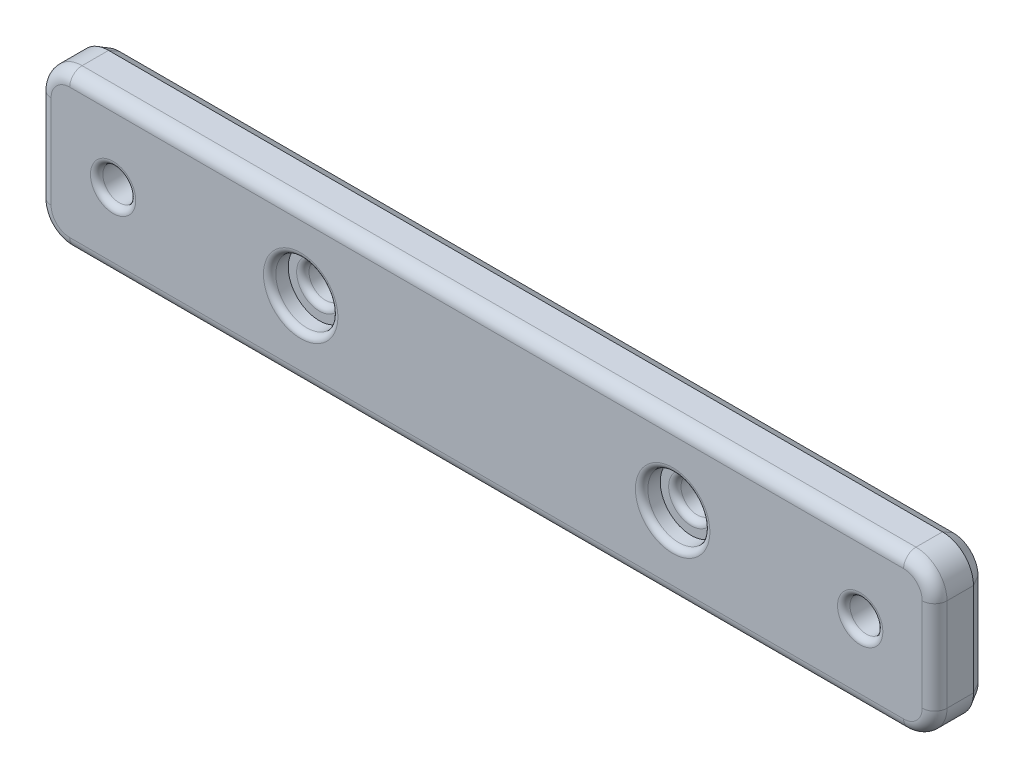
ISO-10303-21;
HEADER;
FILE_DESCRIPTION(('STEP AP214'),'2;1');
FILE_NAME('part.step','',(''),(''),'','','');
FILE_SCHEMA(('AUTOMOTIVE_DESIGN { 1 0 10303 214 1 1 1 1 }'));
ENDSEC;
DATA;
#1=APPLICATION_CONTEXT('core data for automotive mechanical design processes');
#2=APPLICATION_PROTOCOL_DEFINITION('international standard','automotive_design',2000,#1);
#3=PRODUCT_CONTEXT('',#1,'mechanical');
#4=PRODUCT('Part','Part','',(#3));
#5=PRODUCT_RELATED_PRODUCT_CATEGORY('part','',(#4));
#6=PRODUCT_DEFINITION_FORMATION('','',#4);
#7=PRODUCT_DEFINITION_CONTEXT('part definition',#1,'design');
#8=PRODUCT_DEFINITION('design','',#6,#7);
#9=PRODUCT_DEFINITION_SHAPE('','',#8);
#10=(LENGTH_UNIT() NAMED_UNIT(*) SI_UNIT(.MILLI.,.METRE.));
#11=(NAMED_UNIT(*) PLANE_ANGLE_UNIT() SI_UNIT($,.RADIAN.));
#12=(NAMED_UNIT(*) SI_UNIT($,.STERADIAN.) SOLID_ANGLE_UNIT());
#13=UNCERTAINTY_MEASURE_WITH_UNIT(LENGTH_MEASURE(1.E-05),#10,'distance_accuracy_value','');
#14=(GEOMETRIC_REPRESENTATION_CONTEXT(3) GLOBAL_UNCERTAINTY_ASSIGNED_CONTEXT((#13)) GLOBAL_UNIT_ASSIGNED_CONTEXT((#10,
#11,#12)) REPRESENTATION_CONTEXT('',''));
#15=CARTESIAN_POINT('',(0.,0.,0.));
#16=DIRECTION('',(0.,0.,1.));
#17=DIRECTION('',(1.,0.,0.));
#18=AXIS2_PLACEMENT_3D('',#15,#16,#17);
#19=CARTESIAN_POINT('',(-30.,0.,0.));
#20=DIRECTION('',(0.,0.,1.));
#21=DIRECTION('',(1.,0.,0.));
#22=AXIS2_PLACEMENT_3D('',#19,#20,#21);
#23=CYLINDRICAL_SURFACE('',#22,2.65);
#24=CARTESIAN_POINT('',(-30.,0.,1.00000000000005));
#25=DIRECTION('',(0.,0.,-1.));
#26=DIRECTION('',(-1.,0.,0.));
#27=AXIS2_PLACEMENT_3D('',#24,#25,#26);
#28=CIRCLE('',#27,2.65);
#29=CARTESIAN_POINT('',(-32.65,0.,1.00000000000005));
#30=VERTEX_POINT('',#29);
#31=EDGE_CURVE('E49',#30,#30,#28,.T.);
#32=ORIENTED_EDGE('',*,*,#31,.T.);
#33=EDGE_LOOP('',(#32));
#34=FACE_BOUND('',#33,.T.);
#35=CARTESIAN_POINT('',(-30.,0.,4.));
#36=DIRECTION('',(0.,0.,1.));
#37=DIRECTION('',(1.,0.,0.));
#38=AXIS2_PLACEMENT_3D('',#35,#36,#37);
#39=CIRCLE('',#38,2.65);
#40=CARTESIAN_POINT('',(-27.35,0.,4.));
#41=VERTEX_POINT('',#40);
#42=EDGE_CURVE('E234',#41,#41,#39,.T.);
#43=ORIENTED_EDGE('',*,*,#42,.T.);
#44=EDGE_LOOP('',(#43));
#45=FACE_BOUND('',#44,.T.);
#46=ADVANCED_FACE('F40',(#34,#45),#23,.F.);
#47=CARTESIAN_POINT('',(30.,0.,0.));
#48=DIRECTION('',(0.,0.,1.));
#49=DIRECTION('',(1.,0.,0.));
#50=AXIS2_PLACEMENT_3D('',#47,#48,#49);
#51=CYLINDRICAL_SURFACE('',#50,2.65);
#52=CARTESIAN_POINT('',(30.,0.,1.));
#53=DIRECTION('',(0.,0.,-1.));
#54=DIRECTION('',(-1.,0.,0.));
#55=AXIS2_PLACEMENT_3D('',#52,#53,#54);
#56=CIRCLE('',#55,2.65);
#57=CARTESIAN_POINT('',(27.35,0.,1.));
#58=VERTEX_POINT('',#57);
#59=EDGE_CURVE('E329',#58,#58,#56,.T.);
#60=ORIENTED_EDGE('',*,*,#59,.T.);
#61=EDGE_LOOP('',(#60));
#62=FACE_BOUND('',#61,.T.);
#63=CARTESIAN_POINT('',(30.,0.,4.));
#64=DIRECTION('',(0.,0.,1.));
#65=DIRECTION('',(1.,0.,0.));
#66=AXIS2_PLACEMENT_3D('',#63,#64,#65);
#67=CIRCLE('',#66,2.65);
#68=CARTESIAN_POINT('',(32.65,0.,4.));
#69=VERTEX_POINT('',#68);
#70=EDGE_CURVE('E228',#69,#69,#67,.T.);
#71=ORIENTED_EDGE('',*,*,#70,.T.);
#72=EDGE_LOOP('',(#71));
#73=FACE_BOUND('',#72,.T.);
#74=ADVANCED_FACE('F464',(#62,#73),#51,.F.);
#75=CARTESIAN_POINT('',(72.25,-12.5,8.));
#76=DIRECTION('',(-1.,0.,0.));
#77=DIRECTION('',(0.,0.,1.));
#78=AXIS2_PLACEMENT_3D('',#75,#76,#77);
#79=PLANE('',#78);
#80=DIRECTION('',(0.,0.,-1.));
#81=VECTOR('',#80,1.);
#82=CARTESIAN_POINT('',(72.25,-7.5,8.));
#83=LINE('',#82,#81);
#84=CARTESIAN_POINT('',(72.25,-7.5,6.));
#85=VERTEX_POINT('',#84);
#86=CARTESIAN_POINT('',(72.25,-7.5,1.73205080756889));
#87=VERTEX_POINT('',#86);
#88=EDGE_CURVE('E178',#85,#87,#83,.T.);
#89=ORIENTED_EDGE('',*,*,#88,.T.);
#90=DIRECTION('',(0.,1.,0.));
#91=VECTOR('',#90,1.);
#92=CARTESIAN_POINT('',(72.25,7.5,1.73205080756889));
#93=LINE('',#92,#91);
#94=CARTESIAN_POINT('',(72.25,7.5,1.73205080756889));
#95=VERTEX_POINT('',#94);
#96=EDGE_CURVE('E287',#87,#95,#93,.T.);
#97=ORIENTED_EDGE('',*,*,#96,.T.);
#98=DIRECTION('',(0.,0.,-1.));
#99=VECTOR('',#98,1.);
#100=CARTESIAN_POINT('',(72.25,7.5,8.));
#101=LINE('',#100,#99);
#102=CARTESIAN_POINT('',(72.25,7.5,6.));
#103=VERTEX_POINT('',#102);
#104=EDGE_CURVE('E375',#95,#103,#101,.F.);
#105=ORIENTED_EDGE('',*,*,#104,.T.);
#106=DIRECTION('',(0.,1.,0.));
#107=VECTOR('',#106,1.);
#108=CARTESIAN_POINT('',(72.25,-12.5,6.));
#109=LINE('',#108,#107);
#110=EDGE_CURVE('E185',#103,#85,#109,.F.);
#111=ORIENTED_EDGE('',*,*,#110,.T.);
#112=EDGE_LOOP('',(#89,#97,#105,#111));
#113=FACE_BOUND('',#112,.T.);
#114=ADVANCED_FACE('F469',(#113),#79,.F.);
#115=CARTESIAN_POINT('',(-72.25,12.5,8.));
#116=DIRECTION('',(0.,-1.,0.));
#117=DIRECTION('',(0.,0.,-1.));
#118=AXIS2_PLACEMENT_3D('',#115,#116,#117);
#119=PLANE('',#118);
#120=DIRECTION('',(0.,0.,-1.));
#121=VECTOR('',#120,1.);
#122=CARTESIAN_POINT('',(67.25,12.5,8.));
#123=LINE('',#122,#121);
#124=CARTESIAN_POINT('',(67.25,12.5,6.));
#125=VERTEX_POINT('',#124);
#126=CARTESIAN_POINT('',(67.25,12.5,1.73205080756889));
#127=VERTEX_POINT('',#126);
#128=EDGE_CURVE('E372',#125,#127,#123,.T.);
#129=ORIENTED_EDGE('',*,*,#128,.T.);
#130=DIRECTION('',(-1.,0.,0.));
#131=VECTOR('',#130,1.);
#132=CARTESIAN_POINT('',(-67.25,12.5,1.73205080756889));
#133=LINE('',#132,#131);
#134=CARTESIAN_POINT('',(-67.25,12.5,1.73205080756889));
#135=VERTEX_POINT('',#134);
#136=EDGE_CURVE('E261',#127,#135,#133,.T.);
#137=ORIENTED_EDGE('',*,*,#136,.T.);
#138=DIRECTION('',(0.,0.,-1.));
#139=VECTOR('',#138,1.);
#140=CARTESIAN_POINT('',(-67.25,12.5,8.));
#141=LINE('',#140,#139);
#142=CARTESIAN_POINT('',(-67.25,12.5,6.));
#143=VERTEX_POINT('',#142);
#144=EDGE_CURVE('E370',#135,#143,#141,.F.);
#145=ORIENTED_EDGE('',*,*,#144,.T.);
#146=DIRECTION('',(-1.,0.,0.));
#147=VECTOR('',#146,1.);
#148=CARTESIAN_POINT('',(-72.25,12.5,6.));
#149=LINE('',#148,#147);
#150=EDGE_CURVE('E205',#143,#125,#149,.F.);
#151=ORIENTED_EDGE('',*,*,#150,.T.);
#152=EDGE_LOOP('',(#129,#137,#145,#151));
#153=FACE_BOUND('',#152,.T.);
#154=ADVANCED_FACE('F369',(#153),#119,.F.);
#155=CARTESIAN_POINT('',(-72.25,-12.5,8.));
#156=DIRECTION('',(1.,0.,0.));
#157=DIRECTION('',(0.,0.,-1.));
#158=AXIS2_PLACEMENT_3D('',#155,#156,#157);
#159=PLANE('',#158);
#160=DIRECTION('',(0.,0.,-1.));
#161=VECTOR('',#160,1.);
#162=CARTESIAN_POINT('',(-72.25,7.5,8.));
#163=LINE('',#162,#161);
#164=CARTESIAN_POINT('',(-72.25,7.5,6.));
#165=VERTEX_POINT('',#164);
#166=CARTESIAN_POINT('',(-72.25,7.5,1.73205080756889));
#167=VERTEX_POINT('',#166);
#168=EDGE_CURVE('E432',#165,#167,#163,.T.);
#169=ORIENTED_EDGE('',*,*,#168,.T.);
#170=DIRECTION('',(0.,-1.,0.));
#171=VECTOR('',#170,1.);
#172=CARTESIAN_POINT('',(-72.25,-7.5,1.73205080756889));
#173=LINE('',#172,#171);
#174=CARTESIAN_POINT('',(-72.25,-7.5,1.73205080756889));
#175=VERTEX_POINT('',#174);
#176=EDGE_CURVE('E285',#167,#175,#173,.T.);
#177=ORIENTED_EDGE('',*,*,#176,.T.);
#178=DIRECTION('',(0.,0.,-1.));
#179=VECTOR('',#178,1.);
#180=CARTESIAN_POINT('',(-72.25,-7.5,8.));
#181=LINE('',#180,#179);
#182=CARTESIAN_POINT('',(-72.25,-7.5,6.));
#183=VERTEX_POINT('',#182);
#184=EDGE_CURVE('E378',#175,#183,#181,.F.);
#185=ORIENTED_EDGE('',*,*,#184,.T.);
#186=DIRECTION('',(0.,-1.,0.));
#187=VECTOR('',#186,1.);
#188=CARTESIAN_POINT('',(-72.25,-12.5,6.));
#189=LINE('',#188,#187);
#190=EDGE_CURVE('E200',#183,#165,#189,.F.);
#191=ORIENTED_EDGE('',*,*,#190,.T.);
#192=EDGE_LOOP('',(#169,#177,#185,#191));
#193=FACE_BOUND('',#192,.T.);
#194=ADVANCED_FACE('F431',(#193),#159,.F.);
#195=CARTESIAN_POINT('',(-72.25,-12.5,8.));
#196=DIRECTION('',(0.,1.,0.));
#197=DIRECTION('',(0.,0.,1.));
#198=AXIS2_PLACEMENT_3D('',#195,#196,#197);
#199=PLANE('',#198);
#200=DIRECTION('',(0.,0.,-1.));
#201=VECTOR('',#200,1.);
#202=CARTESIAN_POINT('',(-67.25,-12.5,8.));
#203=LINE('',#202,#201);
#204=CARTESIAN_POINT('',(-67.25,-12.5,6.));
#205=VERTEX_POINT('',#204);
#206=CARTESIAN_POINT('',(-67.25,-12.5,1.73205080756889));
#207=VERTEX_POINT('',#206);
#208=EDGE_CURVE('E436',#205,#207,#203,.T.);
#209=ORIENTED_EDGE('',*,*,#208,.T.);
#210=DIRECTION('',(1.,0.,0.));
#211=VECTOR('',#210,1.);
#212=CARTESIAN_POINT('',(67.25,-12.5,1.73205080756889));
#213=LINE('',#212,#211);
#214=CARTESIAN_POINT('',(67.25,-12.5,1.73205080756889));
#215=VERTEX_POINT('',#214);
#216=EDGE_CURVE('E56',#207,#215,#213,.T.);
#217=ORIENTED_EDGE('',*,*,#216,.T.);
#218=DIRECTION('',(0.,0.,-1.));
#219=VECTOR('',#218,1.);
#220=CARTESIAN_POINT('',(67.25,-12.5,8.));
#221=LINE('',#220,#219);
#222=CARTESIAN_POINT('',(67.25,-12.5,6.));
#223=VERTEX_POINT('',#222);
#224=EDGE_CURVE('E440',#215,#223,#221,.F.);
#225=ORIENTED_EDGE('',*,*,#224,.T.);
#226=DIRECTION('',(1.,0.,0.));
#227=VECTOR('',#226,1.);
#228=CARTESIAN_POINT('',(-72.25,-12.5,6.));
#229=LINE('',#228,#227);
#230=EDGE_CURVE('E195',#223,#205,#229,.F.);
#231=ORIENTED_EDGE('',*,*,#230,.T.);
#232=EDGE_LOOP('',(#209,#217,#225,#231));
#233=FACE_BOUND('',#232,.T.);
#234=ADVANCED_FACE('F475',(#233),#199,.F.);
#235=CARTESIAN_POINT('',(0.,0.,8.));
#236=DIRECTION('',(0.,0.,-1.));
#237=DIRECTION('',(-1.,0.,0.));
#238=AXIS2_PLACEMENT_3D('',#235,#236,#237);
#239=PLANE('',#238);
#240=CARTESIAN_POINT('',(60.25,0.,8.));
#241=DIRECTION('',(0.,0.,-1.));
#242=DIRECTION('',(-1.,0.,0.));
#243=AXIS2_PLACEMENT_3D('',#240,#241,#242);
#244=CIRCLE('',#243,3.65);
#245=CARTESIAN_POINT('',(56.6,0.,8.));
#246=VERTEX_POINT('',#245);
#247=EDGE_CURVE('E249',#246,#246,#244,.T.);
#248=ORIENTED_EDGE('',*,*,#247,.T.);
#249=EDGE_LOOP('',(#248));
#250=FACE_BOUND('',#249,.T.);
#251=CARTESIAN_POINT('',(-60.25,0.,8.));
#252=DIRECTION('',(0.,0.,-1.));
#253=DIRECTION('',(-1.,0.,0.));
#254=AXIS2_PLACEMENT_3D('',#251,#252,#253);
#255=CIRCLE('',#254,3.65);
#256=CARTESIAN_POINT('',(-63.9,0.,8.));
#257=VERTEX_POINT('',#256);
#258=EDGE_CURVE('E246',#257,#257,#255,.T.);
#259=ORIENTED_EDGE('',*,*,#258,.T.);
#260=EDGE_LOOP('',(#259));
#261=FACE_BOUND('',#260,.T.);
#262=CARTESIAN_POINT('',(30.,0.,8.));
#263=DIRECTION('',(0.,0.,-1.));
#264=DIRECTION('',(-1.,0.,0.));
#265=AXIS2_PLACEMENT_3D('',#262,#263,#264);
#266=CIRCLE('',#265,6.);
#267=CARTESIAN_POINT('',(24.,0.,8.));
#268=VERTEX_POINT('',#267);
#269=EDGE_CURVE('E243',#268,#268,#266,.T.);
#270=ORIENTED_EDGE('',*,*,#269,.T.);
#271=EDGE_LOOP('',(#270));
#272=FACE_BOUND('',#271,.T.);
#273=CARTESIAN_POINT('',(-30.,0.,8.));
#274=DIRECTION('',(0.,0.,-1.));
#275=DIRECTION('',(-1.,0.,0.));
#276=AXIS2_PLACEMENT_3D('',#273,#274,#275);
#277=CIRCLE('',#276,6.);
#278=CARTESIAN_POINT('',(-36.,0.,8.));
#279=VERTEX_POINT('',#278);
#280=EDGE_CURVE('E240',#279,#279,#277,.T.);
#281=ORIENTED_EDGE('',*,*,#280,.T.);
#282=EDGE_LOOP('',(#281));
#283=FACE_BOUND('',#282,.T.);
#284=DIRECTION('',(0.,1.,0.));
#285=VECTOR('',#284,1.);
#286=CARTESIAN_POINT('',(70.25,0.,8.));
#287=LINE('',#286,#285);
#288=CARTESIAN_POINT('',(70.25,-7.5,8.));
#289=VERTEX_POINT('',#288);
#290=CARTESIAN_POINT('',(70.25,7.5,8.));
#291=VERTEX_POINT('',#290);
#292=EDGE_CURVE('E182',#289,#291,#287,.T.);
#293=ORIENTED_EDGE('',*,*,#292,.T.);
#294=CARTESIAN_POINT('',(67.25,7.5,8.));
#295=DIRECTION('',(0.,0.,-1.));
#296=DIRECTION('',(-1.,0.,0.));
#297=AXIS2_PLACEMENT_3D('',#294,#295,#296);
#298=CIRCLE('',#297,3.);
#299=CARTESIAN_POINT('',(67.25,10.5,8.));
#300=VERTEX_POINT('',#299);
#301=EDGE_CURVE('E162',#291,#300,#298,.F.);
#302=ORIENTED_EDGE('',*,*,#301,.T.);
#303=DIRECTION('',(-1.,0.,0.));
#304=VECTOR('',#303,1.);
#305=CARTESIAN_POINT('',(0.,10.5,8.));
#306=LINE('',#305,#304);
#307=CARTESIAN_POINT('',(-67.25,10.5,8.));
#308=VERTEX_POINT('',#307);
#309=EDGE_CURVE('E171',#300,#308,#306,.T.);
#310=ORIENTED_EDGE('',*,*,#309,.T.);
#311=CARTESIAN_POINT('',(-67.25,7.5,8.));
#312=DIRECTION('',(0.,0.,-1.));
#313=DIRECTION('',(-1.,0.,0.));
#314=AXIS2_PLACEMENT_3D('',#311,#312,#313);
#315=CIRCLE('',#314,3.);
#316=CARTESIAN_POINT('',(-70.25,7.5,8.));
#317=VERTEX_POINT('',#316);
#318=EDGE_CURVE('E177',#308,#317,#315,.F.);
#319=ORIENTED_EDGE('',*,*,#318,.T.);
#320=DIRECTION('',(0.,-1.,0.));
#321=VECTOR('',#320,1.);
#322=CARTESIAN_POINT('',(-70.25,0.,8.));
#323=LINE('',#322,#321);
#324=CARTESIAN_POINT('',(-70.25,-7.5,8.));
#325=VERTEX_POINT('',#324);
#326=EDGE_CURVE('E385',#317,#325,#323,.T.);
#327=ORIENTED_EDGE('',*,*,#326,.T.);
#328=CARTESIAN_POINT('',(-67.25,-7.5,8.));
#329=DIRECTION('',(0.,0.,-1.));
#330=DIRECTION('',(-1.,0.,0.));
#331=AXIS2_PLACEMENT_3D('',#328,#329,#330);
#332=CIRCLE('',#331,3.);
#333=CARTESIAN_POINT('',(-67.25,-10.5,8.));
#334=VERTEX_POINT('',#333);
#335=EDGE_CURVE('E387',#325,#334,#332,.F.);
#336=ORIENTED_EDGE('',*,*,#335,.T.);
#337=DIRECTION('',(1.,0.,0.));
#338=VECTOR('',#337,1.);
#339=CARTESIAN_POINT('',(0.,-10.5,8.));
#340=LINE('',#339,#338);
#341=CARTESIAN_POINT('',(67.25,-10.5,8.));
#342=VERTEX_POINT('',#341);
#343=EDGE_CURVE('E389',#334,#342,#340,.T.);
#344=ORIENTED_EDGE('',*,*,#343,.T.);
#345=CARTESIAN_POINT('',(67.25,-7.5,8.));
#346=DIRECTION('',(0.,0.,-1.));
#347=DIRECTION('',(-1.,0.,0.));
#348=AXIS2_PLACEMENT_3D('',#345,#346,#347);
#349=CIRCLE('',#348,3.);
#350=EDGE_CURVE('E187',#342,#289,#349,.F.);
#351=ORIENTED_EDGE('',*,*,#350,.T.);
#352=EDGE_LOOP('',(#293,#302,#310,#319,#327,#336,#344,#351));
#353=FACE_BOUND('',#352,.T.);
#354=ADVANCED_FACE('F180',(#250,#261,#272,#283,#353),#239,.F.);
#355=CARTESIAN_POINT('',(0.,0.,0.));
#356=DIRECTION('',(0.,0.,-1.));
#357=DIRECTION('',(-1.,0.,0.));
#358=AXIS2_PLACEMENT_3D('',#355,#356,#357);
#359=PLANE('',#358);
#360=CARTESIAN_POINT('',(60.25,0.,0.));
#361=DIRECTION('',(0.,0.,-1.));
#362=DIRECTION('',(-1.,0.,0.));
#363=AXIS2_PLACEMENT_3D('',#360,#361,#362);
#364=CIRCLE('',#363,3.22735026918966);
#365=CARTESIAN_POINT('',(57.0226497308104,0.,0.));
#366=VERTEX_POINT('',#365);
#367=EDGE_CURVE('E323',#366,#366,#364,.F.);
#368=ORIENTED_EDGE('',*,*,#367,.T.);
#369=EDGE_LOOP('',(#368));
#370=FACE_BOUND('',#369,.T.);
#371=CARTESIAN_POINT('',(30.,0.,0.));
#372=DIRECTION('',(0.,0.,-1.));
#373=DIRECTION('',(-1.,0.,0.));
#374=AXIS2_PLACEMENT_3D('',#371,#372,#373);
#375=CIRCLE('',#374,3.22735026918963);
#376=CARTESIAN_POINT('',(26.7726497308104,0.,0.));
#377=VERTEX_POINT('',#376);
#378=EDGE_CURVE('E320',#377,#377,#375,.F.);
#379=ORIENTED_EDGE('',*,*,#378,.T.);
#380=EDGE_LOOP('',(#379));
#381=FACE_BOUND('',#380,.T.);
#382=CARTESIAN_POINT('',(-30.,0.,0.));
#383=DIRECTION('',(0.,0.,-1.));
#384=DIRECTION('',(-1.,0.,0.));
#385=AXIS2_PLACEMENT_3D('',#382,#383,#384);
#386=CIRCLE('',#385,3.22735026918966);
#387=CARTESIAN_POINT('',(-33.2273502691896,0.,0.));
#388=VERTEX_POINT('',#387);
#389=EDGE_CURVE('E317',#388,#388,#386,.F.);
#390=ORIENTED_EDGE('',*,*,#389,.T.);
#391=EDGE_LOOP('',(#390));
#392=FACE_BOUND('',#391,.T.);
#393=CARTESIAN_POINT('',(-60.25,0.,0.));
#394=DIRECTION('',(0.,0.,-1.));
#395=DIRECTION('',(-1.,0.,0.));
#396=AXIS2_PLACEMENT_3D('',#393,#394,#395);
#397=CIRCLE('',#396,3.22735026918961);
#398=CARTESIAN_POINT('',(-63.4773502691896,0.,0.));
#399=VERTEX_POINT('',#398);
#400=EDGE_CURVE('E293',#399,#399,#397,.F.);
#401=ORIENTED_EDGE('',*,*,#400,.T.);
#402=EDGE_LOOP('',(#401));
#403=FACE_BOUND('',#402,.T.);
#404=CARTESIAN_POINT('',(-67.25,7.5,0.));
#405=DIRECTION('',(0.,0.,-1.));
#406=DIRECTION('',(-1.,0.,0.));
#407=AXIS2_PLACEMENT_3D('',#404,#405,#406);
#408=CIRCLE('',#407,3.99999999999999);
#409=CARTESIAN_POINT('',(-71.25,7.5,0.));
#410=VERTEX_POINT('',#409);
#411=CARTESIAN_POINT('',(-67.25,11.5,0.));
#412=VERTEX_POINT('',#411);
#413=EDGE_CURVE('E276',#410,#412,#408,.T.);
#414=ORIENTED_EDGE('',*,*,#413,.T.);
#415=DIRECTION('',(1.,0.,0.));
#416=VECTOR('',#415,1.);
#417=CARTESIAN_POINT('',(67.25,11.5,0.));
#418=LINE('',#417,#416);
#419=CARTESIAN_POINT('',(67.25,11.5,0.));
#420=VERTEX_POINT('',#419);
#421=EDGE_CURVE('E278',#412,#420,#418,.T.);
#422=ORIENTED_EDGE('',*,*,#421,.T.);
#423=CARTESIAN_POINT('',(67.25,7.5,0.));
#424=DIRECTION('',(0.,0.,-1.));
#425=DIRECTION('',(-1.,0.,0.));
#426=AXIS2_PLACEMENT_3D('',#423,#424,#425);
#427=CIRCLE('',#426,3.99999999999999);
#428=CARTESIAN_POINT('',(71.25,7.5,0.));
#429=VERTEX_POINT('',#428);
#430=EDGE_CURVE('E274',#420,#429,#427,.T.);
#431=ORIENTED_EDGE('',*,*,#430,.T.);
#432=DIRECTION('',(0.,-1.,0.));
#433=VECTOR('',#432,1.);
#434=CARTESIAN_POINT('',(71.25,-7.5,0.));
#435=LINE('',#434,#433);
#436=CARTESIAN_POINT('',(71.25,-7.5,0.));
#437=VERTEX_POINT('',#436);
#438=EDGE_CURVE('E270',#429,#437,#435,.T.);
#439=ORIENTED_EDGE('',*,*,#438,.T.);
#440=CARTESIAN_POINT('',(67.25,-7.5,0.));
#441=DIRECTION('',(0.,0.,-1.));
#442=DIRECTION('',(-1.,0.,0.));
#443=AXIS2_PLACEMENT_3D('',#440,#441,#442);
#444=CIRCLE('',#443,3.99999999999999);
#445=CARTESIAN_POINT('',(67.25,-11.5,0.));
#446=VERTEX_POINT('',#445);
#447=EDGE_CURVE('E266',#437,#446,#444,.T.);
#448=ORIENTED_EDGE('',*,*,#447,.T.);
#449=DIRECTION('',(-1.,0.,0.));
#450=VECTOR('',#449,1.);
#451=CARTESIAN_POINT('',(-67.25,-11.5,0.));
#452=LINE('',#451,#450);
#453=CARTESIAN_POINT('',(-67.25,-11.5,0.));
#454=VERTEX_POINT('',#453);
#455=EDGE_CURVE('E264',#446,#454,#452,.T.);
#456=ORIENTED_EDGE('',*,*,#455,.T.);
#457=CARTESIAN_POINT('',(-67.25,-7.5,0.));
#458=DIRECTION('',(0.,0.,-1.));
#459=DIRECTION('',(-1.,0.,0.));
#460=AXIS2_PLACEMENT_3D('',#457,#458,#459);
#461=CIRCLE('',#460,3.99999999999999);
#462=CARTESIAN_POINT('',(-71.25,-7.5,0.));
#463=VERTEX_POINT('',#462);
#464=EDGE_CURVE('E268',#454,#463,#461,.T.);
#465=ORIENTED_EDGE('',*,*,#464,.T.);
#466=DIRECTION('',(0.,1.,0.));
#467=VECTOR('',#466,1.);
#468=CARTESIAN_POINT('',(-71.25,7.5,0.));
#469=LINE('',#468,#467);
#470=EDGE_CURVE('E272',#463,#410,#469,.T.);
#471=ORIENTED_EDGE('',*,*,#470,.T.);
#472=EDGE_LOOP('',(#414,#422,#431,#439,#448,#456,#465,#471));
#473=FACE_BOUND('',#472,.T.);
#474=ADVANCED_FACE('F342',(#370,#381,#392,#403,#473),#359,.T.);
#475=CARTESIAN_POINT('',(60.25,0.,0.));
#476=DIRECTION('',(0.,0.,1.));
#477=DIRECTION('',(1.,0.,0.));
#478=AXIS2_PLACEMENT_3D('',#475,#476,#477);
#479=CYLINDRICAL_SURFACE('',#478,2.65);
#480=CARTESIAN_POINT('',(60.25,0.,1.00000000000005));
#481=DIRECTION('',(0.,0.,-1.));
#482=DIRECTION('',(-1.,0.,0.));
#483=AXIS2_PLACEMENT_3D('',#480,#481,#482);
#484=CIRCLE('',#483,2.65);
#485=CARTESIAN_POINT('',(57.6,0.,1.00000000000005));
#486=VERTEX_POINT('',#485);
#487=EDGE_CURVE('E326',#486,#486,#484,.T.);
#488=ORIENTED_EDGE('',*,*,#487,.T.);
#489=EDGE_LOOP('',(#488));
#490=FACE_BOUND('',#489,.T.);
#491=CARTESIAN_POINT('',(60.25,0.,7.));
#492=DIRECTION('',(0.,0.,-1.));
#493=DIRECTION('',(-1.,0.,0.));
#494=AXIS2_PLACEMENT_3D('',#491,#492,#493);
#495=CIRCLE('',#494,2.65);
#496=CARTESIAN_POINT('',(57.6,0.,7.));
#497=VERTEX_POINT('',#496);
#498=EDGE_CURVE('E237',#497,#497,#495,.F.);
#499=ORIENTED_EDGE('',*,*,#498,.T.);
#500=EDGE_LOOP('',(#499));
#501=FACE_BOUND('',#500,.T.);
#502=ADVANCED_FACE('F345',(#490,#501),#479,.F.);
#503=CARTESIAN_POINT('',(-60.25,0.,0.));
#504=DIRECTION('',(0.,0.,1.));
#505=DIRECTION('',(1.,0.,0.));
#506=AXIS2_PLACEMENT_3D('',#503,#504,#505);
#507=CYLINDRICAL_SURFACE('',#506,2.65);
#508=CARTESIAN_POINT('',(-60.25,0.,0.999999999999943));
#509=DIRECTION('',(0.,0.,-1.));
#510=DIRECTION('',(-1.,0.,0.));
#511=AXIS2_PLACEMENT_3D('',#508,#509,#510);
#512=CIRCLE('',#511,2.65);
#513=CARTESIAN_POINT('',(-62.9,0.,0.999999999999943));
#514=VERTEX_POINT('',#513);
#515=EDGE_CURVE('E11',#514,#514,#512,.T.);
#516=ORIENTED_EDGE('',*,*,#515,.T.);
#517=EDGE_LOOP('',(#516));
#518=FACE_BOUND('',#517,.T.);
#519=CARTESIAN_POINT('',(-60.25,0.,7.));
#520=DIRECTION('',(0.,0.,-1.));
#521=DIRECTION('',(-1.,0.,0.));
#522=AXIS2_PLACEMENT_3D('',#519,#520,#521);
#523=CIRCLE('',#522,2.65);
#524=CARTESIAN_POINT('',(-62.9,0.,7.));
#525=VERTEX_POINT('',#524);
#526=EDGE_CURVE('E252',#525,#525,#523,.F.);
#527=ORIENTED_EDGE('',*,*,#526,.T.);
#528=EDGE_LOOP('',(#527));
#529=FACE_BOUND('',#528,.T.);
#530=ADVANCED_FACE('F613',(#518,#529),#507,.F.);
#531=CARTESIAN_POINT('',(30.,0.,5.));
#532=DIRECTION('',(0.,0.,1.));
#533=DIRECTION('',(1.,0.,0.));
#534=AXIS2_PLACEMENT_3D('',#531,#532,#533);
#535=PLANE('',#534);
#536=CARTESIAN_POINT('',(30.,0.,5.));
#537=DIRECTION('',(0.,0.,1.));
#538=DIRECTION('',(1.,0.,0.));
#539=AXIS2_PLACEMENT_3D('',#536,#537,#538);
#540=CIRCLE('',#539,3.65);
#541=CARTESIAN_POINT('',(33.65,0.,5.));
#542=VERTEX_POINT('',#541);
#543=EDGE_CURVE('E206',#542,#542,#540,.F.);
#544=ORIENTED_EDGE('',*,*,#543,.T.);
#545=EDGE_LOOP('',(#544));
#546=FACE_BOUND('',#545,.T.);
#547=CARTESIAN_POINT('',(30.,0.,5.));
#548=DIRECTION('',(0.,0.,1.));
#549=DIRECTION('',(1.,0.,0.));
#550=AXIS2_PLACEMENT_3D('',#547,#548,#549);
#551=CIRCLE('',#550,5.);
#552=CARTESIAN_POINT('',(35.,0.,5.));
#553=VERTEX_POINT('',#552);
#554=EDGE_CURVE('E225',#553,#553,#551,.T.);
#555=ORIENTED_EDGE('',*,*,#554,.T.);
#556=EDGE_LOOP('',(#555));
#557=FACE_BOUND('',#556,.T.);
#558=ADVANCED_FACE('F610',(#546,#557),#535,.T.);
#559=CARTESIAN_POINT('',(30.,0.,5.));
#560=DIRECTION('',(0.,0.,1.));
#561=DIRECTION('',(1.,0.,0.));
#562=AXIS2_PLACEMENT_3D('',#559,#560,#561);
#563=CYLINDRICAL_SURFACE('',#562,5.);
#564=CARTESIAN_POINT('',(30.,0.,7.));
#565=DIRECTION('',(0.,0.,-1.));
#566=DIRECTION('',(-1.,0.,0.));
#567=AXIS2_PLACEMENT_3D('',#564,#565,#566);
#568=CIRCLE('',#567,5.);
#569=CARTESIAN_POINT('',(25.,0.,7.));
#570=VERTEX_POINT('',#569);
#571=EDGE_CURVE('E255',#570,#570,#568,.F.);
#572=ORIENTED_EDGE('',*,*,#571,.T.);
#573=EDGE_LOOP('',(#572));
#574=FACE_BOUND('',#573,.T.);
#575=ORIENTED_EDGE('',*,*,#554,.F.);
#576=EDGE_LOOP('',(#575));
#577=FACE_BOUND('',#576,.T.);
#578=ADVANCED_FACE('F459',(#574,#577),#563,.F.);
#579=CARTESIAN_POINT('',(-30.,0.,5.));
#580=DIRECTION('',(0.,0.,1.));
#581=DIRECTION('',(1.,0.,0.));
#582=AXIS2_PLACEMENT_3D('',#579,#580,#581);
#583=PLANE('',#582);
#584=CARTESIAN_POINT('',(-30.,0.,5.));
#585=DIRECTION('',(0.,0.,1.));
#586=DIRECTION('',(1.,0.,0.));
#587=AXIS2_PLACEMENT_3D('',#584,#585,#586);
#588=CIRCLE('',#587,3.65);
#589=CARTESIAN_POINT('',(-26.35,0.,5.));
#590=VERTEX_POINT('',#589);
#591=EDGE_CURVE('E231',#590,#590,#588,.F.);
#592=ORIENTED_EDGE('',*,*,#591,.T.);
#593=EDGE_LOOP('',(#592));
#594=FACE_BOUND('',#593,.T.);
#595=CARTESIAN_POINT('',(-30.,0.,5.));
#596=DIRECTION('',(0.,0.,1.));
#597=DIRECTION('',(1.,0.,0.));
#598=AXIS2_PLACEMENT_3D('',#595,#596,#597);
#599=CIRCLE('',#598,5.);
#600=CARTESIAN_POINT('',(-25.,0.,5.));
#601=VERTEX_POINT('',#600);
#602=EDGE_CURVE('E442',#601,#601,#599,.T.);
#603=ORIENTED_EDGE('',*,*,#602,.T.);
#604=EDGE_LOOP('',(#603));
#605=FACE_BOUND('',#604,.T.);
#606=ADVANCED_FACE('F448',(#594,#605),#583,.T.);
#607=CARTESIAN_POINT('',(-30.,0.,5.));
#608=DIRECTION('',(0.,0.,1.));
#609=DIRECTION('',(1.,0.,0.));
#610=AXIS2_PLACEMENT_3D('',#607,#608,#609);
#611=CYLINDRICAL_SURFACE('',#610,5.);
#612=CARTESIAN_POINT('',(-30.,0.,7.));
#613=DIRECTION('',(0.,0.,-1.));
#614=DIRECTION('',(-1.,0.,0.));
#615=AXIS2_PLACEMENT_3D('',#612,#613,#614);
#616=CIRCLE('',#615,5.);
#617=CARTESIAN_POINT('',(-35.,0.,7.));
#618=VERTEX_POINT('',#617);
#619=EDGE_CURVE('E258',#618,#618,#616,.F.);
#620=ORIENTED_EDGE('',*,*,#619,.T.);
#621=EDGE_LOOP('',(#620));
#622=FACE_BOUND('',#621,.T.);
#623=ORIENTED_EDGE('',*,*,#602,.F.);
#624=EDGE_LOOP('',(#623));
#625=FACE_BOUND('',#624,.T.);
#626=ADVANCED_FACE('F450',(#622,#625),#611,.F.);
#627=CARTESIAN_POINT('',(-67.25,-7.5,8.));
#628=DIRECTION('',(0.,0.,-1.));
#629=DIRECTION('',(-1.,0.,0.));
#630=AXIS2_PLACEMENT_3D('',#627,#628,#629);
#631=CYLINDRICAL_SURFACE('',#630,5.);
#632=ORIENTED_EDGE('',*,*,#184,.F.);
#633=CARTESIAN_POINT('',(-67.25,-7.5,1.73205080756889));
#634=DIRECTION('',(0.,0.,-1.));
#635=DIRECTION('',(-1.,0.,0.));
#636=AXIS2_PLACEMENT_3D('',#633,#634,#635);
#637=CIRCLE('',#636,5.);
#638=EDGE_CURVE('E64',#175,#207,#637,.F.);
#639=ORIENTED_EDGE('',*,*,#638,.T.);
#640=ORIENTED_EDGE('',*,*,#208,.F.);
#641=CARTESIAN_POINT('',(-67.25,-7.5,6.));
#642=DIRECTION('',(0.,0.,-1.));
#643=DIRECTION('',(-1.,0.,0.));
#644=AXIS2_PLACEMENT_3D('',#641,#642,#643);
#645=CIRCLE('',#644,5.);
#646=EDGE_CURVE('E197',#205,#183,#645,.T.);
#647=ORIENTED_EDGE('',*,*,#646,.T.);
#648=EDGE_LOOP('',(#632,#639,#640,#647));
#649=FACE_BOUND('',#648,.T.);
#650=ADVANCED_FACE('F433',(#649),#631,.T.);
#651=CARTESIAN_POINT('',(-67.25,7.5,8.));
#652=DIRECTION('',(0.,0.,-1.));
#653=DIRECTION('',(-1.,0.,0.));
#654=AXIS2_PLACEMENT_3D('',#651,#652,#653);
#655=CYLINDRICAL_SURFACE('',#654,5.);
#656=ORIENTED_EDGE('',*,*,#144,.F.);
#657=CARTESIAN_POINT('',(-67.25,7.5,1.73205080756889));
#658=DIRECTION('',(0.,0.,-1.));
#659=DIRECTION('',(-1.,0.,0.));
#660=AXIS2_PLACEMENT_3D('',#657,#658,#659);
#661=CIRCLE('',#660,5.);
#662=EDGE_CURVE('E281',#135,#167,#661,.F.);
#663=ORIENTED_EDGE('',*,*,#662,.T.);
#664=ORIENTED_EDGE('',*,*,#168,.F.);
#665=CARTESIAN_POINT('',(-67.25,7.5,6.));
#666=DIRECTION('',(0.,0.,-1.));
#667=DIRECTION('',(-1.,0.,0.));
#668=AXIS2_PLACEMENT_3D('',#665,#666,#667);
#669=CIRCLE('',#668,5.);
#670=EDGE_CURVE('E202',#165,#143,#669,.T.);
#671=ORIENTED_EDGE('',*,*,#670,.T.);
#672=EDGE_LOOP('',(#656,#663,#664,#671));
#673=FACE_BOUND('',#672,.T.);
#674=ADVANCED_FACE('F373',(#673),#655,.T.);
#675=CARTESIAN_POINT('',(67.25,-7.5,8.));
#676=DIRECTION('',(0.,0.,-1.));
#677=DIRECTION('',(-1.,0.,0.));
#678=AXIS2_PLACEMENT_3D('',#675,#676,#677);
#679=CYLINDRICAL_SURFACE('',#678,5.);
#680=ORIENTED_EDGE('',*,*,#224,.F.);
#681=CARTESIAN_POINT('',(67.25,-7.5,1.73205080756889));
#682=DIRECTION('',(0.,0.,-1.));
#683=DIRECTION('',(-1.,0.,0.));
#684=AXIS2_PLACEMENT_3D('',#681,#682,#683);
#685=CIRCLE('',#684,5.);
#686=EDGE_CURVE('E290',#215,#87,#685,.F.);
#687=ORIENTED_EDGE('',*,*,#686,.T.);
#688=ORIENTED_EDGE('',*,*,#88,.F.);
#689=CARTESIAN_POINT('',(67.25,-7.5,6.));
#690=DIRECTION('',(0.,0.,-1.));
#691=DIRECTION('',(-1.,0.,0.));
#692=AXIS2_PLACEMENT_3D('',#689,#690,#691);
#693=CIRCLE('',#692,5.);
#694=EDGE_CURVE('E192',#85,#223,#693,.T.);
#695=ORIENTED_EDGE('',*,*,#694,.T.);
#696=EDGE_LOOP('',(#680,#687,#688,#695));
#697=FACE_BOUND('',#696,.T.);
#698=ADVANCED_FACE('F488',(#697),#679,.T.);
#699=CARTESIAN_POINT('',(67.25,7.5,8.));
#700=DIRECTION('',(0.,0.,-1.));
#701=DIRECTION('',(-1.,0.,0.));
#702=AXIS2_PLACEMENT_3D('',#699,#700,#701);
#703=CYLINDRICAL_SURFACE('',#702,5.);
#704=ORIENTED_EDGE('',*,*,#104,.F.);
#705=CARTESIAN_POINT('',(67.25,7.5,1.73205080756889));
#706=DIRECTION('',(0.,0.,-1.));
#707=DIRECTION('',(-1.,0.,0.));
#708=AXIS2_PLACEMENT_3D('',#705,#706,#707);
#709=CIRCLE('',#708,5.);
#710=EDGE_CURVE('E283',#95,#127,#709,.F.);
#711=ORIENTED_EDGE('',*,*,#710,.T.);
#712=ORIENTED_EDGE('',*,*,#128,.F.);
#713=CARTESIAN_POINT('',(67.25,7.5,6.));
#714=DIRECTION('',(0.,0.,-1.));
#715=DIRECTION('',(-1.,0.,0.));
#716=AXIS2_PLACEMENT_3D('',#713,#714,#715);
#717=CIRCLE('',#716,5.);
#718=EDGE_CURVE('E164',#125,#103,#717,.T.);
#719=ORIENTED_EDGE('',*,*,#718,.T.);
#720=EDGE_LOOP('',(#704,#711,#712,#719));
#721=FACE_BOUND('',#720,.T.);
#722=ADVANCED_FACE('F404',(#721),#703,.T.);
#723=CARTESIAN_POINT('',(-67.25,-7.5,6.));
#724=DIRECTION('',(0.,0.,-1.));
#725=DIRECTION('',(-1.,0.,0.));
#726=AXIS2_PLACEMENT_3D('',#723,#724,#725);
#727=TOROIDAL_SURFACE('',#726,3.,2.);
#728=CARTESIAN_POINT('',(-70.25,-7.5,6.));
#729=DIRECTION('',(0.,1.,0.));
#730=DIRECTION('',(0.,0.,1.));
#731=AXIS2_PLACEMENT_3D('',#728,#729,#730);
#732=CIRCLE('',#731,2.);
#733=EDGE_CURVE('E219',#183,#325,#732,.T.);
#734=ORIENTED_EDGE('',*,*,#733,.F.);
#735=ORIENTED_EDGE('',*,*,#646,.F.);
#736=CARTESIAN_POINT('',(-67.25,-10.5,6.));
#737=DIRECTION('',(1.,0.,0.));
#738=DIRECTION('',(0.,0.,-1.));
#739=AXIS2_PLACEMENT_3D('',#736,#737,#738);
#740=CIRCLE('',#739,2.);
#741=EDGE_CURVE('E222',#334,#205,#740,.T.);
#742=ORIENTED_EDGE('',*,*,#741,.F.);
#743=ORIENTED_EDGE('',*,*,#335,.F.);
#744=EDGE_LOOP('',(#734,#735,#742,#743));
#745=FACE_BOUND('',#744,.T.);
#746=ADVANCED_FACE('F494',(#745),#727,.T.);
#747=CARTESIAN_POINT('',(0.,-10.5,6.));
#748=DIRECTION('',(1.,0.,0.));
#749=DIRECTION('',(0.,0.,-1.));
#750=AXIS2_PLACEMENT_3D('',#747,#748,#749);
#751=CYLINDRICAL_SURFACE('',#750,2.);
#752=ORIENTED_EDGE('',*,*,#741,.T.);
#753=ORIENTED_EDGE('',*,*,#230,.F.);
#754=CARTESIAN_POINT('',(67.25,-10.5,6.));
#755=DIRECTION('',(1.,0.,0.));
#756=DIRECTION('',(0.,0.,-1.));
#757=AXIS2_PLACEMENT_3D('',#754,#755,#756);
#758=CIRCLE('',#757,2.);
#759=EDGE_CURVE('E216',#342,#223,#758,.T.);
#760=ORIENTED_EDGE('',*,*,#759,.F.);
#761=ORIENTED_EDGE('',*,*,#343,.F.);
#762=EDGE_LOOP('',(#752,#753,#760,#761));
#763=FACE_BOUND('',#762,.T.);
#764=ADVANCED_FACE('F511',(#763),#751,.T.);
#765=CARTESIAN_POINT('',(-70.25,0.,6.));
#766=DIRECTION('',(0.,-1.,0.));
#767=DIRECTION('',(0.,0.,-1.));
#768=AXIS2_PLACEMENT_3D('',#765,#766,#767);
#769=CYLINDRICAL_SURFACE('',#768,2.);
#770=ORIENTED_EDGE('',*,*,#733,.T.);
#771=ORIENTED_EDGE('',*,*,#326,.F.);
#772=CARTESIAN_POINT('',(-70.25,7.5,6.));
#773=DIRECTION('',(0.,1.,0.));
#774=DIRECTION('',(0.,0.,1.));
#775=AXIS2_PLACEMENT_3D('',#772,#773,#774);
#776=CIRCLE('',#775,2.);
#777=EDGE_CURVE('E213',#165,#317,#776,.T.);
#778=ORIENTED_EDGE('',*,*,#777,.F.);
#779=ORIENTED_EDGE('',*,*,#190,.F.);
#780=EDGE_LOOP('',(#770,#771,#778,#779));
#781=FACE_BOUND('',#780,.T.);
#782=ADVANCED_FACE('F508',(#781),#769,.T.);
#783=CARTESIAN_POINT('',(67.25,-7.5,6.));
#784=DIRECTION('',(0.,0.,-1.));
#785=DIRECTION('',(-1.,0.,0.));
#786=AXIS2_PLACEMENT_3D('',#783,#784,#785);
#787=TOROIDAL_SURFACE('',#786,3.,2.);
#788=ORIENTED_EDGE('',*,*,#759,.T.);
#789=ORIENTED_EDGE('',*,*,#694,.F.);
#790=CARTESIAN_POINT('',(70.25,-7.5,6.));
#791=DIRECTION('',(0.,1.,0.));
#792=DIRECTION('',(0.,0.,1.));
#793=AXIS2_PLACEMENT_3D('',#790,#791,#792);
#794=CIRCLE('',#793,2.);
#795=EDGE_CURVE('E210',#289,#85,#794,.T.);
#796=ORIENTED_EDGE('',*,*,#795,.F.);
#797=ORIENTED_EDGE('',*,*,#350,.F.);
#798=EDGE_LOOP('',(#788,#789,#796,#797));
#799=FACE_BOUND('',#798,.T.);
#800=ADVANCED_FACE('F396',(#799),#787,.T.);
#801=CARTESIAN_POINT('',(-67.25,7.5,6.));
#802=DIRECTION('',(0.,0.,-1.));
#803=DIRECTION('',(-1.,0.,0.));
#804=AXIS2_PLACEMENT_3D('',#801,#802,#803);
#805=TOROIDAL_SURFACE('',#804,3.,2.);
#806=ORIENTED_EDGE('',*,*,#777,.T.);
#807=ORIENTED_EDGE('',*,*,#318,.F.);
#808=CARTESIAN_POINT('',(-67.25,10.5,6.));
#809=DIRECTION('',(1.,0.,0.));
#810=DIRECTION('',(0.,0.,-1.));
#811=AXIS2_PLACEMENT_3D('',#808,#809,#810);
#812=CIRCLE('',#811,2.);
#813=EDGE_CURVE('E174',#143,#308,#812,.T.);
#814=ORIENTED_EDGE('',*,*,#813,.F.);
#815=ORIENTED_EDGE('',*,*,#670,.F.);
#816=EDGE_LOOP('',(#806,#807,#814,#815));
#817=FACE_BOUND('',#816,.T.);
#818=ADVANCED_FACE('F502',(#817),#805,.T.);
#819=CARTESIAN_POINT('',(70.25,0.,6.));
#820=DIRECTION('',(0.,1.,0.));
#821=DIRECTION('',(0.,0.,1.));
#822=AXIS2_PLACEMENT_3D('',#819,#820,#821);
#823=CYLINDRICAL_SURFACE('',#822,2.);
#824=ORIENTED_EDGE('',*,*,#795,.T.);
#825=ORIENTED_EDGE('',*,*,#110,.F.);
#826=CARTESIAN_POINT('',(70.25,7.5,6.));
#827=DIRECTION('',(0.,1.,0.));
#828=DIRECTION('',(0.,0.,1.));
#829=AXIS2_PLACEMENT_3D('',#826,#827,#828);
#830=CIRCLE('',#829,2.);
#831=EDGE_CURVE('E167',#291,#103,#830,.T.);
#832=ORIENTED_EDGE('',*,*,#831,.F.);
#833=ORIENTED_EDGE('',*,*,#292,.F.);
#834=EDGE_LOOP('',(#824,#825,#832,#833));
#835=FACE_BOUND('',#834,.T.);
#836=ADVANCED_FACE('F399',(#835),#823,.T.);
#837=CARTESIAN_POINT('',(0.,10.5,6.));
#838=DIRECTION('',(-1.,0.,0.));
#839=DIRECTION('',(0.,0.,1.));
#840=AXIS2_PLACEMENT_3D('',#837,#838,#839);
#841=CYLINDRICAL_SURFACE('',#840,2.);
#842=ORIENTED_EDGE('',*,*,#813,.T.);
#843=ORIENTED_EDGE('',*,*,#309,.F.);
#844=CARTESIAN_POINT('',(67.25,10.5,6.));
#845=DIRECTION('',(1.,0.,0.));
#846=DIRECTION('',(0.,0.,-1.));
#847=AXIS2_PLACEMENT_3D('',#844,#845,#846);
#848=CIRCLE('',#847,2.);
#849=EDGE_CURVE('E157',#125,#300,#848,.T.);
#850=ORIENTED_EDGE('',*,*,#849,.F.);
#851=ORIENTED_EDGE('',*,*,#150,.F.);
#852=EDGE_LOOP('',(#842,#843,#850,#851));
#853=FACE_BOUND('',#852,.T.);
#854=ADVANCED_FACE('F172',(#853),#841,.T.);
#855=CARTESIAN_POINT('',(67.25,7.5,6.));
#856=DIRECTION('',(0.,0.,-1.));
#857=DIRECTION('',(-1.,0.,0.));
#858=AXIS2_PLACEMENT_3D('',#855,#856,#857);
#859=TOROIDAL_SURFACE('',#858,3.,2.);
#860=ORIENTED_EDGE('',*,*,#831,.T.);
#861=ORIENTED_EDGE('',*,*,#718,.F.);
#862=ORIENTED_EDGE('',*,*,#849,.T.);
#863=ORIENTED_EDGE('',*,*,#301,.F.);
#864=EDGE_LOOP('',(#860,#861,#862,#863));
#865=FACE_BOUND('',#864,.T.);
#866=ADVANCED_FACE('F160',(#865),#859,.T.);
#867=CARTESIAN_POINT('',(30.,0.,4.));
#868=DIRECTION('',(0.,0.,1.));
#869=DIRECTION('',(1.,0.,0.));
#870=AXIS2_PLACEMENT_3D('',#867,#868,#869);
#871=TOROIDAL_SURFACE('',#870,3.65,1.);
#872=ORIENTED_EDGE('',*,*,#70,.F.);
#873=EDGE_LOOP('',(#872));
#874=FACE_BOUND('',#873,.T.);
#875=ORIENTED_EDGE('',*,*,#543,.F.);
#876=EDGE_LOOP('',(#875));
#877=FACE_BOUND('',#876,.T.);
#878=ADVANCED_FACE('F497',(#874,#877),#871,.T.);
#879=CARTESIAN_POINT('',(-30.,0.,4.));
#880=DIRECTION('',(0.,0.,1.));
#881=DIRECTION('',(1.,0.,0.));
#882=AXIS2_PLACEMENT_3D('',#879,#880,#881);
#883=TOROIDAL_SURFACE('',#882,3.65,1.);
#884=ORIENTED_EDGE('',*,*,#42,.F.);
#885=EDGE_LOOP('',(#884));
#886=FACE_BOUND('',#885,.T.);
#887=ORIENTED_EDGE('',*,*,#591,.F.);
#888=EDGE_LOOP('',(#887));
#889=FACE_BOUND('',#888,.T.);
#890=ADVANCED_FACE('F521',(#886,#889),#883,.T.);
#891=CARTESIAN_POINT('',(60.25,0.,7.));
#892=DIRECTION('',(0.,0.,-1.));
#893=DIRECTION('',(-1.,0.,0.));
#894=AXIS2_PLACEMENT_3D('',#891,#892,#893);
#895=TOROIDAL_SURFACE('',#894,3.65,1.);
#896=ORIENTED_EDGE('',*,*,#247,.F.);
#897=EDGE_LOOP('',(#896));
#898=FACE_BOUND('',#897,.T.);
#899=ORIENTED_EDGE('',*,*,#498,.F.);
#900=EDGE_LOOP('',(#899));
#901=FACE_BOUND('',#900,.T.);
#902=ADVANCED_FACE('F525',(#898,#901),#895,.T.);
#903=CARTESIAN_POINT('',(-60.25,0.,7.));
#904=DIRECTION('',(0.,0.,-1.));
#905=DIRECTION('',(-1.,0.,0.));
#906=AXIS2_PLACEMENT_3D('',#903,#904,#905);
#907=TOROIDAL_SURFACE('',#906,3.65,1.);
#908=ORIENTED_EDGE('',*,*,#258,.F.);
#909=EDGE_LOOP('',(#908));
#910=FACE_BOUND('',#909,.T.);
#911=ORIENTED_EDGE('',*,*,#526,.F.);
#912=EDGE_LOOP('',(#911));
#913=FACE_BOUND('',#912,.T.);
#914=ADVANCED_FACE('F529',(#910,#913),#907,.T.);
#915=CARTESIAN_POINT('',(30.,0.,7.));
#916=DIRECTION('',(0.,0.,-1.));
#917=DIRECTION('',(-1.,0.,0.));
#918=AXIS2_PLACEMENT_3D('',#915,#916,#917);
#919=TOROIDAL_SURFACE('',#918,6.,1.);
#920=ORIENTED_EDGE('',*,*,#269,.F.);
#921=EDGE_LOOP('',(#920));
#922=FACE_BOUND('',#921,.T.);
#923=ORIENTED_EDGE('',*,*,#571,.F.);
#924=EDGE_LOOP('',(#923));
#925=FACE_BOUND('',#924,.T.);
#926=ADVANCED_FACE('F533',(#922,#925),#919,.T.);
#927=CARTESIAN_POINT('',(-30.,0.,7.));
#928=DIRECTION('',(0.,0.,-1.));
#929=DIRECTION('',(-1.,0.,0.));
#930=AXIS2_PLACEMENT_3D('',#927,#928,#929);
#931=TOROIDAL_SURFACE('',#930,6.,1.);
#932=ORIENTED_EDGE('',*,*,#280,.F.);
#933=EDGE_LOOP('',(#932));
#934=FACE_BOUND('',#933,.T.);
#935=ORIENTED_EDGE('',*,*,#619,.F.);
#936=EDGE_LOOP('',(#935));
#937=FACE_BOUND('',#936,.T.);
#938=ADVANCED_FACE('F537',(#934,#937),#931,.T.);
#939=CARTESIAN_POINT('',(-72.25,-12.5,1.73205080756889));
#940=DIRECTION('',(0.,-0.866025403784437,-0.500000000000004));
#941=DIRECTION('',(-1.,0.,0.));
#942=AXIS2_PLACEMENT_3D('',#939,#940,#941);
#943=PLANE('',#942);
#944=DIRECTION('',(0.,-0.500000000000004,0.866025403784437));
#945=VECTOR('',#944,1.);
#946=CARTESIAN_POINT('',(-67.25,-11.5,0.));
#947=LINE('',#946,#945);
#948=EDGE_CURVE('E310',#454,#207,#947,.T.);
#949=ORIENTED_EDGE('',*,*,#948,.F.);
#950=ORIENTED_EDGE('',*,*,#455,.F.);
#951=DIRECTION('',(0.,0.500000000000004,-0.866025403784437));
#952=VECTOR('',#951,1.);
#953=CARTESIAN_POINT('',(67.25,-12.5,1.73205080756889));
#954=LINE('',#953,#952);
#955=EDGE_CURVE('E168',#215,#446,#954,.T.);
#956=ORIENTED_EDGE('',*,*,#955,.F.);
#957=ORIENTED_EDGE('',*,*,#216,.F.);
#958=EDGE_LOOP('',(#949,#950,#956,#957));
#959=FACE_BOUND('',#958,.T.);
#960=ADVANCED_FACE('F422',(#959),#943,.T.);
#961=CARTESIAN_POINT('',(67.25,-7.5,0.));
#962=DIRECTION('',(0.,0.,1.));
#963=DIRECTION('',(1.,0.,0.));
#964=AXIS2_PLACEMENT_3D('',#961,#962,#963);
#965=CONICAL_SURFACE('',#964,3.99999999999999,0.523598775598301);
#966=ORIENTED_EDGE('',*,*,#955,.T.);
#967=ORIENTED_EDGE('',*,*,#447,.F.);
#968=DIRECTION('',(-0.500000000000004,0.,-0.866025403784436));
#969=VECTOR('',#968,1.);
#970=CARTESIAN_POINT('',(72.25,-7.5,1.73205080756889));
#971=LINE('',#970,#969);
#972=EDGE_CURVE('E307',#87,#437,#971,.T.);
#973=ORIENTED_EDGE('',*,*,#972,.F.);
#974=ORIENTED_EDGE('',*,*,#686,.F.);
#975=EDGE_LOOP('',(#966,#967,#973,#974));
#976=FACE_BOUND('',#975,.T.);
#977=ADVANCED_FACE('F417',(#976),#965,.T.);
#978=CARTESIAN_POINT('',(-67.25,-7.5,0.));
#979=DIRECTION('',(0.,0.,1.));
#980=DIRECTION('',(1.,0.,0.));
#981=AXIS2_PLACEMENT_3D('',#978,#979,#980);
#982=CONICAL_SURFACE('',#981,3.99999999999999,0.523598775598303);
#983=ORIENTED_EDGE('',*,*,#948,.T.);
#984=ORIENTED_EDGE('',*,*,#638,.F.);
#985=DIRECTION('',(-0.500000000000004,0.,0.866025403784436));
#986=VECTOR('',#985,1.);
#987=CARTESIAN_POINT('',(-71.25,-7.5,0.));
#988=LINE('',#987,#986);
#989=EDGE_CURVE('E304',#463,#175,#988,.T.);
#990=ORIENTED_EDGE('',*,*,#989,.F.);
#991=ORIENTED_EDGE('',*,*,#464,.F.);
#992=EDGE_LOOP('',(#983,#984,#990,#991));
#993=FACE_BOUND('',#992,.T.);
#994=ADVANCED_FACE('F426',(#993),#982,.T.);
#995=CARTESIAN_POINT('',(72.25,-12.5,1.73205080756889));
#996=DIRECTION('',(0.866025403784437,0.,-0.500000000000004));
#997=DIRECTION('',(0.,-1.,0.));
#998=AXIS2_PLACEMENT_3D('',#995,#996,#997);
#999=PLANE('',#998);
#1000=ORIENTED_EDGE('',*,*,#972,.T.);
#1001=ORIENTED_EDGE('',*,*,#438,.F.);
#1002=DIRECTION('',(-0.500000000000004,0.,-0.866025403784437));
#1003=VECTOR('',#1002,1.);
#1004=CARTESIAN_POINT('',(72.25,7.5,1.73205080756889));
#1005=LINE('',#1004,#1003);
#1006=EDGE_CURVE('E301',#95,#429,#1005,.T.);
#1007=ORIENTED_EDGE('',*,*,#1006,.F.);
#1008=ORIENTED_EDGE('',*,*,#96,.F.);
#1009=EDGE_LOOP('',(#1000,#1001,#1007,#1008));
#1010=FACE_BOUND('',#1009,.T.);
#1011=ADVANCED_FACE('F412',(#1010),#999,.T.);
#1012=CARTESIAN_POINT('',(-72.25,-12.5,1.73205080756889));
#1013=DIRECTION('',(-0.866025403784437,0.,-0.500000000000004));
#1014=DIRECTION('',(0.,1.,0.));
#1015=AXIS2_PLACEMENT_3D('',#1012,#1013,#1014);
#1016=PLANE('',#1015);
#1017=ORIENTED_EDGE('',*,*,#989,.T.);
#1018=ORIENTED_EDGE('',*,*,#176,.F.);
#1019=DIRECTION('',(-0.500000000000004,0.,0.866025403784437));
#1020=VECTOR('',#1019,1.);
#1021=CARTESIAN_POINT('',(-71.25,7.5,0.));
#1022=LINE('',#1021,#1020);
#1023=EDGE_CURVE('E298',#410,#167,#1022,.T.);
#1024=ORIENTED_EDGE('',*,*,#1023,.F.);
#1025=ORIENTED_EDGE('',*,*,#470,.F.);
#1026=EDGE_LOOP('',(#1017,#1018,#1024,#1025));
#1027=FACE_BOUND('',#1026,.T.);
#1028=ADVANCED_FACE('F429',(#1027),#1016,.T.);
#1029=CARTESIAN_POINT('',(67.25,7.5,0.));
#1030=DIRECTION('',(0.,0.,1.));
#1031=DIRECTION('',(1.,0.,0.));
#1032=AXIS2_PLACEMENT_3D('',#1029,#1030,#1031);
#1033=CONICAL_SURFACE('',#1032,3.99999999999999,0.523598775598303);
#1034=ORIENTED_EDGE('',*,*,#1006,.T.);
#1035=ORIENTED_EDGE('',*,*,#430,.F.);
#1036=DIRECTION('',(0.,-0.500000000000002,-0.866025403784438));
#1037=VECTOR('',#1036,1.);
#1038=CARTESIAN_POINT('',(67.25,12.5,1.73205080756889));
#1039=LINE('',#1038,#1037);
#1040=EDGE_CURVE('E296',#127,#420,#1039,.T.);
#1041=ORIENTED_EDGE('',*,*,#1040,.F.);
#1042=ORIENTED_EDGE('',*,*,#710,.F.);
#1043=EDGE_LOOP('',(#1034,#1035,#1041,#1042));
#1044=FACE_BOUND('',#1043,.T.);
#1045=ADVANCED_FACE('F408',(#1044),#1033,.T.);
#1046=CARTESIAN_POINT('',(-67.25,7.5,0.));
#1047=DIRECTION('',(0.,0.,1.));
#1048=DIRECTION('',(1.,0.,0.));
#1049=AXIS2_PLACEMENT_3D('',#1046,#1047,#1048);
#1050=CONICAL_SURFACE('',#1049,3.99999999999999,0.523598775598301);
#1051=ORIENTED_EDGE('',*,*,#1023,.T.);
#1052=ORIENTED_EDGE('',*,*,#662,.F.);
#1053=DIRECTION('',(0.,0.500000000000002,0.866025403784438));
#1054=VECTOR('',#1053,1.);
#1055=CARTESIAN_POINT('',(-67.25,11.5,0.));
#1056=LINE('',#1055,#1054);
#1057=EDGE_CURVE('E294',#412,#135,#1056,.T.);
#1058=ORIENTED_EDGE('',*,*,#1057,.F.);
#1059=ORIENTED_EDGE('',*,*,#413,.F.);
#1060=EDGE_LOOP('',(#1051,#1052,#1058,#1059));
#1061=FACE_BOUND('',#1060,.T.);
#1062=ADVANCED_FACE('F362',(#1061),#1050,.T.);
#1063=CARTESIAN_POINT('',(-72.25,12.5,1.73205080756889));
#1064=DIRECTION('',(0.,0.866025403784437,-0.500000000000004));
#1065=DIRECTION('',(1.,0.,0.));
#1066=AXIS2_PLACEMENT_3D('',#1063,#1064,#1065);
#1067=PLANE('',#1066);
#1068=ORIENTED_EDGE('',*,*,#1040,.T.);
#1069=ORIENTED_EDGE('',*,*,#421,.F.);
#1070=ORIENTED_EDGE('',*,*,#1057,.T.);
#1071=ORIENTED_EDGE('',*,*,#136,.F.);
#1072=EDGE_LOOP('',(#1068,#1069,#1070,#1071));
#1073=FACE_BOUND('',#1072,.T.);
#1074=ADVANCED_FACE('F357',(#1073),#1067,.T.);
#1075=CARTESIAN_POINT('',(60.25,0.,0.));
#1076=DIRECTION('',(0.,0.,-1.));
#1077=DIRECTION('',(-1.,0.,0.));
#1078=AXIS2_PLACEMENT_3D('',#1075,#1076,#1077);
#1079=CONICAL_SURFACE('',#1078,3.22735026918966,0.523598775598303);
#1080=ORIENTED_EDGE('',*,*,#487,.F.);
#1081=EDGE_LOOP('',(#1080));
#1082=FACE_BOUND('',#1081,.T.);
#1083=ORIENTED_EDGE('',*,*,#367,.F.);
#1084=EDGE_LOOP('',(#1083));
#1085=FACE_BOUND('',#1084,.T.);
#1086=ADVANCED_FACE('F549',(#1082,#1085),#1079,.F.);
#1087=CARTESIAN_POINT('',(30.,0.,0.));
#1088=DIRECTION('',(0.,0.,-1.));
#1089=DIRECTION('',(-1.,0.,0.));
#1090=AXIS2_PLACEMENT_3D('',#1087,#1088,#1089);
#1091=CONICAL_SURFACE('',#1090,3.22735026918963,0.523598775598302);
#1092=ORIENTED_EDGE('',*,*,#59,.F.);
#1093=EDGE_LOOP('',(#1092));
#1094=FACE_BOUND('',#1093,.T.);
#1095=ORIENTED_EDGE('',*,*,#378,.F.);
#1096=EDGE_LOOP('',(#1095));
#1097=FACE_BOUND('',#1096,.T.);
#1098=ADVANCED_FACE('F339',(#1094,#1097),#1091,.F.);
#1099=CARTESIAN_POINT('',(-30.,0.,0.));
#1100=DIRECTION('',(0.,0.,-1.));
#1101=DIRECTION('',(-1.,0.,0.));
#1102=AXIS2_PLACEMENT_3D('',#1099,#1100,#1101);
#1103=CONICAL_SURFACE('',#1102,3.22735026918966,0.523598775598303);
#1104=ORIENTED_EDGE('',*,*,#31,.F.);
#1105=EDGE_LOOP('',(#1104));
#1106=FACE_BOUND('',#1105,.T.);
#1107=ORIENTED_EDGE('',*,*,#389,.F.);
#1108=EDGE_LOOP('',(#1107));
#1109=FACE_BOUND('',#1108,.T.);
#1110=ADVANCED_FACE('F336',(#1106,#1109),#1103,.F.);
#1111=CARTESIAN_POINT('',(-60.25,0.,0.));
#1112=DIRECTION('',(0.,0.,-1.));
#1113=DIRECTION('',(-1.,0.,0.));
#1114=AXIS2_PLACEMENT_3D('',#1111,#1112,#1113);
#1115=CONICAL_SURFACE('',#1114,3.22735026918961,0.523598775598308);
#1116=ORIENTED_EDGE('',*,*,#515,.F.);
#1117=EDGE_LOOP('',(#1116));
#1118=FACE_BOUND('',#1117,.T.);
#1119=ORIENTED_EDGE('',*,*,#400,.F.);
#1120=EDGE_LOOP('',(#1119));
#1121=FACE_BOUND('',#1120,.T.);
#1122=ADVANCED_FACE('F43',(#1118,#1121),#1115,.F.);
#1123=CLOSED_SHELL('',(#46,#74,#114,#154,#194,#234,#354,#474,#502,#530,#558,#578,#606,#626,#650,
#674,#698,#722,#746,#764,#782,#800,#818,#836,#854,#866,#878,#890,#902,#914,#926,#938,#960,#977,
#994,#1011,#1028,#1045,#1062,#1074,#1086,#1098,#1110,#1122));
#1124=MANIFOLD_SOLID_BREP('B2',#1123);
#1125=ADVANCED_BREP_SHAPE_REPRESENTATION('',(#18,#1124),#14);
#1126=SHAPE_DEFINITION_REPRESENTATION(#9,#1125);
ENDSEC;
END-ISO-10303-21;
